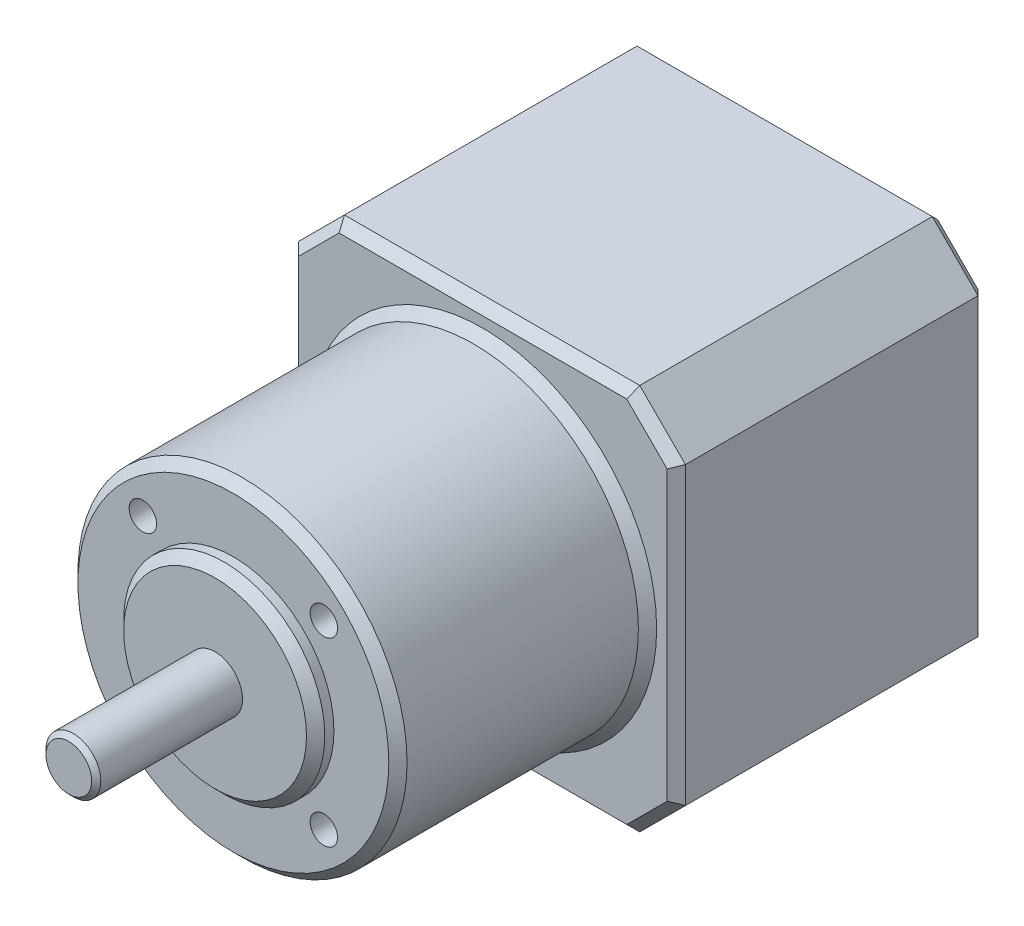
ISO-10303-21;
HEADER;
FILE_DESCRIPTION(('STEP AP214'),'2;1');
FILE_NAME('part.step','',(''),(''),'','','');
FILE_SCHEMA(('AUTOMOTIVE_DESIGN { 1 0 10303 214 1 1 1 1 }'));
ENDSEC;
DATA;
#1=APPLICATION_CONTEXT('core data for automotive mechanical design processes');
#2=APPLICATION_PROTOCOL_DEFINITION('international standard','automotive_design',2000,#1);
#3=PRODUCT_CONTEXT('',#1,'mechanical');
#4=PRODUCT('Part','Part','',(#3));
#5=PRODUCT_RELATED_PRODUCT_CATEGORY('part','',(#4));
#6=PRODUCT_DEFINITION_FORMATION('','',#4);
#7=PRODUCT_DEFINITION_CONTEXT('part definition',#1,'design');
#8=PRODUCT_DEFINITION('design','',#6,#7);
#9=PRODUCT_DEFINITION_SHAPE('','',#8);
#10=(LENGTH_UNIT() NAMED_UNIT(*) SI_UNIT(.MILLI.,.METRE.));
#11=(NAMED_UNIT(*) PLANE_ANGLE_UNIT() SI_UNIT($,.RADIAN.));
#12=(NAMED_UNIT(*) SI_UNIT($,.STERADIAN.) SOLID_ANGLE_UNIT());
#13=UNCERTAINTY_MEASURE_WITH_UNIT(LENGTH_MEASURE(1.E-05),#10,'distance_accuracy_value','');
#14=(GEOMETRIC_REPRESENTATION_CONTEXT(3) GLOBAL_UNCERTAINTY_ASSIGNED_CONTEXT((#13)) GLOBAL_UNIT_ASSIGNED_CONTEXT((#10,
#11,#12)) REPRESENTATION_CONTEXT('',''));
#15=CARTESIAN_POINT('',(0.,0.,0.));
#16=DIRECTION('',(0.,0.,1.));
#17=DIRECTION('',(1.,0.,0.));
#18=AXIS2_PLACEMENT_3D('',#15,#16,#17);
#19=CARTESIAN_POINT('',(10.575,10.575,30.6344737091177));
#20=DIRECTION('',(-1.,0.,0.));
#21=DIRECTION('',(0.,0.,1.));
#22=AXIS2_PLACEMENT_3D('',#19,#20,#21);
#23=PLANE('',#22);
#24=DIRECTION('',(0.,0.,1.));
#25=VECTOR('',#24,1.);
#26=CARTESIAN_POINT('',(10.575,8.075,30.6344737091177));
#27=LINE('',#26,#25);
#28=CARTESIAN_POINT('',(10.575,8.075,14.1344737091177));
#29=VERTEX_POINT('',#28);
#30=CARTESIAN_POINT('',(10.575,8.075,30.1344737091177));
#31=VERTEX_POINT('',#30);
#32=EDGE_CURVE('E445',#29,#31,#27,.T.);
#33=ORIENTED_EDGE('',*,*,#32,.T.);
#34=DIRECTION('',(0.,-1.,0.));
#35=VECTOR('',#34,1.);
#36=CARTESIAN_POINT('',(10.575,-8.075,30.1344737091177));
#37=LINE('',#36,#35);
#38=CARTESIAN_POINT('',(10.575,-8.075,30.1344737091177));
#39=VERTEX_POINT('',#38);
#40=EDGE_CURVE('E198',#31,#39,#37,.T.);
#41=ORIENTED_EDGE('',*,*,#40,.T.);
#42=DIRECTION('',(0.,0.,-1.));
#43=VECTOR('',#42,1.);
#44=CARTESIAN_POINT('',(10.575,-8.075,30.6344737091177));
#45=LINE('',#44,#43);
#46=CARTESIAN_POINT('',(10.575,-8.075,14.1344737091177));
#47=VERTEX_POINT('',#46);
#48=EDGE_CURVE('E422',#39,#47,#45,.T.);
#49=ORIENTED_EDGE('',*,*,#48,.T.);
#50=DIRECTION('',(0.,1.,0.));
#51=VECTOR('',#50,1.);
#52=CARTESIAN_POINT('',(10.575,10.575,14.1344737091177));
#53=LINE('',#52,#51);
#54=EDGE_CURVE('E196',#47,#29,#53,.T.);
#55=ORIENTED_EDGE('',*,*,#54,.T.);
#56=EDGE_LOOP('',(#33,#41,#49,#55));
#57=FACE_BOUND('',#56,.T.);
#58=ADVANCED_FACE('F39',(#57),#23,.F.);
#59=CARTESIAN_POINT('',(-10.575,10.575,30.6344737091177));
#60=DIRECTION('',(0.,-1.,0.));
#61=DIRECTION('',(0.,0.,-1.));
#62=AXIS2_PLACEMENT_3D('',#59,#60,#61);
#63=PLANE('',#62);
#64=DIRECTION('',(0.,0.,1.));
#65=VECTOR('',#64,1.);
#66=CARTESIAN_POINT('',(-8.07499999999999,10.575,30.6344737091177));
#67=LINE('',#66,#65);
#68=CARTESIAN_POINT('',(-8.07499999999999,10.575,14.1344737091177));
#69=VERTEX_POINT('',#68);
#70=CARTESIAN_POINT('',(-8.07499999999999,10.575,30.1344737091177));
#71=VERTEX_POINT('',#70);
#72=EDGE_CURVE('E442',#69,#71,#67,.T.);
#73=ORIENTED_EDGE('',*,*,#72,.T.);
#74=DIRECTION('',(1.,0.,0.));
#75=VECTOR('',#74,1.);
#76=CARTESIAN_POINT('',(8.075,10.575,30.1344737091177));
#77=LINE('',#76,#75);
#78=CARTESIAN_POINT('',(8.075,10.575,30.1344737091177));
#79=VERTEX_POINT('',#78);
#80=EDGE_CURVE('E190',#71,#79,#77,.T.);
#81=ORIENTED_EDGE('',*,*,#80,.T.);
#82=DIRECTION('',(0.,0.,-1.));
#83=VECTOR('',#82,1.);
#84=CARTESIAN_POINT('',(8.075,10.575,30.6344737091177));
#85=LINE('',#84,#83);
#86=CARTESIAN_POINT('',(8.075,10.575,14.1344737091177));
#87=VERTEX_POINT('',#86);
#88=EDGE_CURVE('E439',#79,#87,#85,.T.);
#89=ORIENTED_EDGE('',*,*,#88,.T.);
#90=DIRECTION('',(-1.,0.,0.));
#91=VECTOR('',#90,1.);
#92=CARTESIAN_POINT('',(-10.575,10.575,14.1344737091177));
#93=LINE('',#92,#91);
#94=EDGE_CURVE('E188',#87,#69,#93,.T.);
#95=ORIENTED_EDGE('',*,*,#94,.T.);
#96=EDGE_LOOP('',(#73,#81,#89,#95));
#97=FACE_BOUND('',#96,.T.);
#98=ADVANCED_FACE('F305',(#97),#63,.F.);
#99=CARTESIAN_POINT('',(-10.575,10.575,30.6344737091177));
#100=DIRECTION('',(1.,0.,0.));
#101=DIRECTION('',(0.,1.,0.));
#102=AXIS2_PLACEMENT_3D('',#99,#100,#101);
#103=PLANE('',#102);
#104=DIRECTION('',(0.,0.,1.));
#105=VECTOR('',#104,1.);
#106=CARTESIAN_POINT('',(-10.575,-8.07499999999998,30.6344737091177));
#107=LINE('',#106,#105);
#108=CARTESIAN_POINT('',(-10.575,-8.07499999999998,14.1344737091177));
#109=VERTEX_POINT('',#108);
#110=CARTESIAN_POINT('',(-10.575,-8.07499999999998,30.1344737091177));
#111=VERTEX_POINT('',#110);
#112=EDGE_CURVE('E436',#109,#111,#107,.T.);
#113=ORIENTED_EDGE('',*,*,#112,.T.);
#114=DIRECTION('',(0.,1.,0.));
#115=VECTOR('',#114,1.);
#116=CARTESIAN_POINT('',(-10.575,8.075,30.1344737091177));
#117=LINE('',#116,#115);
#118=CARTESIAN_POINT('',(-10.575,8.075,30.1344737091177));
#119=VERTEX_POINT('',#118);
#120=EDGE_CURVE('E215',#111,#119,#117,.T.);
#121=ORIENTED_EDGE('',*,*,#120,.T.);
#122=DIRECTION('',(0.,0.,-1.));
#123=VECTOR('',#122,1.);
#124=CARTESIAN_POINT('',(-10.575,8.075,30.6344737091177));
#125=LINE('',#124,#123);
#126=CARTESIAN_POINT('',(-10.575,8.075,14.1344737091177));
#127=VERTEX_POINT('',#126);
#128=EDGE_CURVE('E433',#119,#127,#125,.T.);
#129=ORIENTED_EDGE('',*,*,#128,.T.);
#130=DIRECTION('',(0.,-1.,0.));
#131=VECTOR('',#130,1.);
#132=CARTESIAN_POINT('',(-10.575,10.575,14.1344737091177));
#133=LINE('',#132,#131);
#134=EDGE_CURVE('E213',#127,#109,#133,.T.);
#135=ORIENTED_EDGE('',*,*,#134,.T.);
#136=EDGE_LOOP('',(#113,#121,#129,#135));
#137=FACE_BOUND('',#136,.T.);
#138=ADVANCED_FACE('F311',(#137),#103,.F.);
#139=CARTESIAN_POINT('',(-10.575,-10.575,30.6344737091177));
#140=DIRECTION('',(0.,1.,0.));
#141=DIRECTION('',(0.,0.,1.));
#142=AXIS2_PLACEMENT_3D('',#139,#140,#141);
#143=PLANE('',#142);
#144=DIRECTION('',(0.,0.,1.));
#145=VECTOR('',#144,1.);
#146=CARTESIAN_POINT('',(8.075,-10.575,30.6344737091177));
#147=LINE('',#146,#145);
#148=CARTESIAN_POINT('',(8.075,-10.575,14.1344737091177));
#149=VERTEX_POINT('',#148);
#150=CARTESIAN_POINT('',(8.075,-10.575,30.1344737091177));
#151=VERTEX_POINT('',#150);
#152=EDGE_CURVE('E263',#149,#151,#147,.T.);
#153=ORIENTED_EDGE('',*,*,#152,.T.);
#154=DIRECTION('',(-1.,0.,0.));
#155=VECTOR('',#154,1.);
#156=CARTESIAN_POINT('',(-8.07499999999999,-10.575,30.1344737091177));
#157=LINE('',#156,#155);
#158=CARTESIAN_POINT('',(-8.07499999999999,-10.575,30.1344737091177));
#159=VERTEX_POINT('',#158);
#160=EDGE_CURVE('E207',#151,#159,#157,.T.);
#161=ORIENTED_EDGE('',*,*,#160,.T.);
#162=DIRECTION('',(0.,0.,-1.));
#163=VECTOR('',#162,1.);
#164=CARTESIAN_POINT('',(-8.07499999999999,-10.575,30.6344737091177));
#165=LINE('',#164,#163);
#166=CARTESIAN_POINT('',(-8.07499999999999,-10.575,14.1344737091177));
#167=VERTEX_POINT('',#166);
#168=EDGE_CURVE('E430',#159,#167,#165,.T.);
#169=ORIENTED_EDGE('',*,*,#168,.T.);
#170=DIRECTION('',(1.,0.,0.));
#171=VECTOR('',#170,1.);
#172=CARTESIAN_POINT('',(-10.575,-10.575,14.1344737091177));
#173=LINE('',#172,#171);
#174=EDGE_CURVE('E205',#167,#149,#173,.T.);
#175=ORIENTED_EDGE('',*,*,#174,.T.);
#176=EDGE_LOOP('',(#153,#161,#169,#175));
#177=FACE_BOUND('',#176,.T.);
#178=ADVANCED_FACE('F483',(#177),#143,.F.);
#179=CARTESIAN_POINT('',(0.,0.,30.6344737091177));
#180=DIRECTION('',(0.,0.,1.));
#181=DIRECTION('',(1.,0.,0.));
#182=AXIS2_PLACEMENT_3D('',#179,#180,#181);
#183=PLANE('',#182);
#184=DIRECTION('',(-1.,0.,0.));
#185=VECTOR('',#184,1.);
#186=CARTESIAN_POINT('',(-8.07499999999999,10.075,30.6344737091177));
#187=LINE('',#186,#185);
#188=CARTESIAN_POINT('',(7.86789321881345,10.075,30.6344737091177));
#189=VERTEX_POINT('',#188);
#190=CARTESIAN_POINT('',(-7.86789321881344,10.075,30.6344737091177));
#191=VERTEX_POINT('',#190);
#192=EDGE_CURVE('E178',#189,#191,#187,.T.);
#193=ORIENTED_EDGE('',*,*,#192,.T.);
#194=DIRECTION('',(-0.707106781186549,-0.707106781186547,0.));
#195=VECTOR('',#194,1.);
#196=CARTESIAN_POINT('',(-8.97144660940671,8.97144660940674,30.6344737091177));
#197=LINE('',#196,#195);
#198=CARTESIAN_POINT('',(-10.075,7.86789321881346,30.6344737091177));
#199=VERTEX_POINT('',#198);
#200=EDGE_CURVE('E157',#191,#199,#197,.T.);
#201=ORIENTED_EDGE('',*,*,#200,.T.);
#202=DIRECTION('',(0.,-1.,0.));
#203=VECTOR('',#202,1.);
#204=CARTESIAN_POINT('',(-10.075,-8.07499999999998,30.6344737091177));
#205=LINE('',#204,#203);
#206=CARTESIAN_POINT('',(-10.075,-7.86789321881343,30.6344737091177));
#207=VERTEX_POINT('',#206);
#208=EDGE_CURVE('E166',#199,#207,#205,.T.);
#209=ORIENTED_EDGE('',*,*,#208,.T.);
#210=DIRECTION('',(0.707106781186546,-0.707106781186549,0.));
#211=VECTOR('',#210,1.);
#212=CARTESIAN_POINT('',(-8.97144660940673,-8.97144660940669,30.6344737091177));
#213=LINE('',#212,#211);
#214=CARTESIAN_POINT('',(-7.86789321881344,-10.075,30.6344737091177));
#215=VERTEX_POINT('',#214);
#216=EDGE_CURVE('E172',#207,#215,#213,.T.);
#217=ORIENTED_EDGE('',*,*,#216,.T.);
#218=DIRECTION('',(1.,0.,0.));
#219=VECTOR('',#218,1.);
#220=CARTESIAN_POINT('',(8.07499999999999,-10.075,30.6344737091177));
#221=LINE('',#220,#219);
#222=CARTESIAN_POINT('',(7.86789321881345,-10.075,30.6344737091177));
#223=VERTEX_POINT('',#222);
#224=EDGE_CURVE('E450',#215,#223,#221,.T.);
#225=ORIENTED_EDGE('',*,*,#224,.T.);
#226=DIRECTION('',(0.707106781186548,0.707106781186547,0.));
#227=VECTOR('',#226,1.);
#228=CARTESIAN_POINT('',(8.97144660940671,-8.97144660940672,30.6344737091177));
#229=LINE('',#228,#227);
#230=CARTESIAN_POINT('',(10.075,-7.86789321881344,30.6344737091177));
#231=VERTEX_POINT('',#230);
#232=EDGE_CURVE('E452',#223,#231,#229,.T.);
#233=ORIENTED_EDGE('',*,*,#232,.T.);
#234=DIRECTION('',(0.,1.,0.));
#235=VECTOR('',#234,1.);
#236=CARTESIAN_POINT('',(10.075,8.075,30.6344737091177));
#237=LINE('',#236,#235);
#238=CARTESIAN_POINT('',(10.075,7.86789321881345,30.6344737091177));
#239=VERTEX_POINT('',#238);
#240=EDGE_CURVE('E454',#231,#239,#237,.T.);
#241=ORIENTED_EDGE('',*,*,#240,.T.);
#242=DIRECTION('',(-0.707106781186547,0.707106781186549,0.));
#243=VECTOR('',#242,1.);
#244=CARTESIAN_POINT('',(8.97144660940674,8.97144660940671,30.6344737091177));
#245=LINE('',#244,#243);
#246=EDGE_CURVE('E183',#239,#189,#245,.T.);
#247=ORIENTED_EDGE('',*,*,#246,.T.);
#248=EDGE_LOOP('',(#193,#201,#209,#217,#225,#233,#241,#247));
#249=FACE_BOUND('',#248,.T.);
#250=CARTESIAN_POINT('',(0.,0.,30.6344737091177));
#251=DIRECTION('',(0.,0.,1.));
#252=DIRECTION('',(1.,0.,0.));
#253=AXIS2_PLACEMENT_3D('',#250,#251,#252);
#254=CIRCLE('',#253,9.49999999999999);
#255=CARTESIAN_POINT('',(9.49999999999999,0.,30.6344737091177));
#256=VERTEX_POINT('',#255);
#257=EDGE_CURVE('E173',#256,#256,#254,.F.);
#258=ORIENTED_EDGE('',*,*,#257,.T.);
#259=EDGE_LOOP('',(#258));
#260=FACE_BOUND('',#259,.T.);
#261=ADVANCED_FACE('F175',(#249,#260),#183,.T.);
#262=CARTESIAN_POINT('',(0.,0.,13.6344737091177));
#263=DIRECTION('',(0.,0.,1.));
#264=DIRECTION('',(1.,0.,0.));
#265=AXIS2_PLACEMENT_3D('',#262,#263,#264);
#266=PLANE('',#265);
#267=DIRECTION('',(0.,-1.,0.));
#268=VECTOR('',#267,1.);
#269=CARTESIAN_POINT('',(10.075,0.,13.6344737091177));
#270=LINE('',#269,#268);
#271=CARTESIAN_POINT('',(10.075,7.86789321881345,13.6344737091177));
#272=VERTEX_POINT('',#271);
#273=CARTESIAN_POINT('',(10.075,-7.86789321881344,13.6344737091177));
#274=VERTEX_POINT('',#273);
#275=EDGE_CURVE('E54',#272,#274,#270,.T.);
#276=ORIENTED_EDGE('',*,*,#275,.T.);
#277=DIRECTION('',(-0.707106781186548,-0.707106781186547,0.));
#278=VECTOR('',#277,1.);
#279=CARTESIAN_POINT('',(7.72144660940671,-10.2214466094067,13.6344737091177));
#280=LINE('',#279,#278);
#281=CARTESIAN_POINT('',(7.86789321881345,-10.075,13.6344737091177));
#282=VERTEX_POINT('',#281);
#283=EDGE_CURVE('E235',#274,#282,#280,.T.);
#284=ORIENTED_EDGE('',*,*,#283,.T.);
#285=DIRECTION('',(-1.,0.,0.));
#286=VECTOR('',#285,1.);
#287=CARTESIAN_POINT('',(0.,-10.075,13.6344737091177));
#288=LINE('',#287,#286);
#289=CARTESIAN_POINT('',(-7.86789321881344,-10.075,13.6344737091177));
#290=VERTEX_POINT('',#289);
#291=EDGE_CURVE('E223',#282,#290,#288,.T.);
#292=ORIENTED_EDGE('',*,*,#291,.T.);
#293=DIRECTION('',(-0.707106781186546,0.707106781186549,0.));
#294=VECTOR('',#293,1.);
#295=CARTESIAN_POINT('',(-10.2214466094067,-7.72144660940671,13.6344737091177));
#296=LINE('',#295,#294);
#297=CARTESIAN_POINT('',(-10.075,-7.86789321881343,13.6344737091177));
#298=VERTEX_POINT('',#297);
#299=EDGE_CURVE('E225',#290,#298,#296,.T.);
#300=ORIENTED_EDGE('',*,*,#299,.T.);
#301=DIRECTION('',(0.,1.,0.));
#302=VECTOR('',#301,1.);
#303=CARTESIAN_POINT('',(-10.075,0.,13.6344737091177));
#304=LINE('',#303,#302);
#305=CARTESIAN_POINT('',(-10.075,7.86789321881346,13.6344737091177));
#306=VERTEX_POINT('',#305);
#307=EDGE_CURVE('E227',#298,#306,#304,.T.);
#308=ORIENTED_EDGE('',*,*,#307,.T.);
#309=DIRECTION('',(0.707106781186549,0.707106781186547,0.));
#310=VECTOR('',#309,1.);
#311=CARTESIAN_POINT('',(-7.72144660940671,10.2214466094067,13.6344737091177));
#312=LINE('',#311,#310);
#313=CARTESIAN_POINT('',(-7.86789321881344,10.075,13.6344737091177));
#314=VERTEX_POINT('',#313);
#315=EDGE_CURVE('E229',#306,#314,#312,.T.);
#316=ORIENTED_EDGE('',*,*,#315,.T.);
#317=DIRECTION('',(1.,0.,0.));
#318=VECTOR('',#317,1.);
#319=CARTESIAN_POINT('',(0.,10.075,13.6344737091177));
#320=LINE('',#319,#318);
#321=CARTESIAN_POINT('',(7.86789321881345,10.075,13.6344737091177));
#322=VERTEX_POINT('',#321);
#323=EDGE_CURVE('E231',#314,#322,#320,.T.);
#324=ORIENTED_EDGE('',*,*,#323,.T.);
#325=DIRECTION('',(0.707106781186547,-0.707106781186549,0.));
#326=VECTOR('',#325,1.);
#327=CARTESIAN_POINT('',(10.2214466094067,7.72144660940672,13.6344737091177));
#328=LINE('',#327,#326);
#329=EDGE_CURVE('E59',#322,#272,#328,.T.);
#330=ORIENTED_EDGE('',*,*,#329,.T.);
#331=EDGE_LOOP('',(#276,#284,#292,#300,#308,#316,#324,#330));
#332=FACE_BOUND('',#331,.T.);
#333=ADVANCED_FACE('F321',(#332),#266,.F.);
#334=CARTESIAN_POINT('',(-8.07499999999999,-10.575,30.6344737091177));
#335=DIRECTION('',(0.707106781186549,0.707106781186546,0.));
#336=DIRECTION('',(0.,0.,-1.));
#337=AXIS2_PLACEMENT_3D('',#334,#335,#336);
#338=PLANE('',#337);
#339=ORIENTED_EDGE('',*,*,#168,.F.);
#340=DIRECTION('',(0.707106781186546,-0.707106781186549,0.));
#341=VECTOR('',#340,1.);
#342=CARTESIAN_POINT('',(-8.07499999999999,-10.575,30.1344737091177));
#343=LINE('',#342,#341);
#344=EDGE_CURVE('E211',#159,#111,#343,.F.);
#345=ORIENTED_EDGE('',*,*,#344,.T.);
#346=ORIENTED_EDGE('',*,*,#112,.F.);
#347=DIRECTION('',(-0.707106781186546,0.707106781186549,0.));
#348=VECTOR('',#347,1.);
#349=CARTESIAN_POINT('',(-8.07499999999999,-10.575,14.1344737091177));
#350=LINE('',#349,#348);
#351=EDGE_CURVE('E209',#109,#167,#350,.F.);
#352=ORIENTED_EDGE('',*,*,#351,.T.);
#353=EDGE_LOOP('',(#339,#345,#346,#352));
#354=FACE_BOUND('',#353,.T.);
#355=ADVANCED_FACE('F317',(#354),#338,.F.);
#356=CARTESIAN_POINT('',(-10.575,8.075,30.6344737091177));
#357=DIRECTION('',(0.707106781186547,-0.707106781186549,0.));
#358=DIRECTION('',(0.,0.,-1.));
#359=AXIS2_PLACEMENT_3D('',#356,#357,#358);
#360=PLANE('',#359);
#361=ORIENTED_EDGE('',*,*,#128,.F.);
#362=DIRECTION('',(-0.707106781186549,-0.707106781186547,0.));
#363=VECTOR('',#362,1.);
#364=CARTESIAN_POINT('',(-10.575,8.075,30.1344737091177));
#365=LINE('',#364,#363);
#366=EDGE_CURVE('E159',#119,#71,#365,.F.);
#367=ORIENTED_EDGE('',*,*,#366,.T.);
#368=ORIENTED_EDGE('',*,*,#72,.F.);
#369=DIRECTION('',(0.707106781186549,0.707106781186547,0.));
#370=VECTOR('',#369,1.);
#371=CARTESIAN_POINT('',(-10.575,8.075,14.1344737091177));
#372=LINE('',#371,#370);
#373=EDGE_CURVE('E180',#69,#127,#372,.F.);
#374=ORIENTED_EDGE('',*,*,#373,.T.);
#375=EDGE_LOOP('',(#361,#367,#368,#374));
#376=FACE_BOUND('',#375,.T.);
#377=ADVANCED_FACE('F320',(#376),#360,.F.);
#378=CARTESIAN_POINT('',(10.575,-8.075,30.6344737091177));
#379=DIRECTION('',(-0.707106781186547,0.707106781186548,0.));
#380=DIRECTION('',(0.,0.,-1.));
#381=AXIS2_PLACEMENT_3D('',#378,#379,#380);
#382=PLANE('',#381);
#383=ORIENTED_EDGE('',*,*,#48,.F.);
#384=DIRECTION('',(0.707106781186548,0.707106781186547,0.));
#385=VECTOR('',#384,1.);
#386=CARTESIAN_POINT('',(10.575,-8.075,30.1344737091177));
#387=LINE('',#386,#385);
#388=EDGE_CURVE('E203',#39,#151,#387,.F.);
#389=ORIENTED_EDGE('',*,*,#388,.T.);
#390=ORIENTED_EDGE('',*,*,#152,.F.);
#391=DIRECTION('',(-0.707106781186548,-0.707106781186547,0.));
#392=VECTOR('',#391,1.);
#393=CARTESIAN_POINT('',(10.575,-8.07499999999999,14.1344737091177));
#394=LINE('',#393,#392);
#395=EDGE_CURVE('E200',#149,#47,#394,.F.);
#396=ORIENTED_EDGE('',*,*,#395,.T.);
#397=EDGE_LOOP('',(#383,#389,#390,#396));
#398=FACE_BOUND('',#397,.T.);
#399=ADVANCED_FACE('F325',(#398),#382,.F.);
#400=CARTESIAN_POINT('',(8.075,10.575,30.6344737091177));
#401=DIRECTION('',(-0.707106781186549,-0.707106781186547,0.));
#402=DIRECTION('',(0.,0.,-1.));
#403=AXIS2_PLACEMENT_3D('',#400,#401,#402);
#404=PLANE('',#403);
#405=ORIENTED_EDGE('',*,*,#88,.F.);
#406=DIRECTION('',(-0.707106781186547,0.707106781186549,0.));
#407=VECTOR('',#406,1.);
#408=CARTESIAN_POINT('',(8.075,10.575,30.1344737091177));
#409=LINE('',#408,#407);
#410=EDGE_CURVE('E194',#79,#31,#409,.F.);
#411=ORIENTED_EDGE('',*,*,#410,.T.);
#412=ORIENTED_EDGE('',*,*,#32,.F.);
#413=DIRECTION('',(0.707106781186547,-0.707106781186549,0.));
#414=VECTOR('',#413,1.);
#415=CARTESIAN_POINT('',(8.075,10.575,14.1344737091177));
#416=LINE('',#415,#414);
#417=EDGE_CURVE('E192',#29,#87,#416,.F.);
#418=ORIENTED_EDGE('',*,*,#417,.T.);
#419=EDGE_LOOP('',(#405,#411,#412,#418));
#420=FACE_BOUND('',#419,.T.);
#421=ADVANCED_FACE('F329',(#420),#404,.F.);
#422=CARTESIAN_POINT('',(0.,0.,44.2844737091177));
#423=DIRECTION('',(0.,0.,-1.));
#424=DIRECTION('',(-1.,0.,0.));
#425=AXIS2_PLACEMENT_3D('',#422,#423,#424);
#426=CYLINDRICAL_SURFACE('',#425,9.);
#427=CARTESIAN_POINT('',(0.,0.,31.1344737091177));
#428=DIRECTION('',(0.,0.,1.));
#429=DIRECTION('',(1.,0.,0.));
#430=AXIS2_PLACEMENT_3D('',#427,#428,#429);
#431=CIRCLE('',#430,9.);
#432=CARTESIAN_POINT('',(9.,0.,31.1344737091177));
#433=VERTEX_POINT('',#432);
#434=EDGE_CURVE('E220',#433,#433,#431,.T.);
#435=ORIENTED_EDGE('',*,*,#434,.T.);
#436=EDGE_LOOP('',(#435));
#437=FACE_BOUND('',#436,.T.);
#438=CARTESIAN_POINT('',(0.,0.,43.7844737091177));
#439=DIRECTION('',(0.,0.,1.));
#440=DIRECTION('',(1.,0.,0.));
#441=AXIS2_PLACEMENT_3D('',#438,#439,#440);
#442=CIRCLE('',#441,9.);
#443=CARTESIAN_POINT('',(9.,0.,43.7844737091177));
#444=VERTEX_POINT('',#443);
#445=EDGE_CURVE('E217',#444,#444,#442,.F.);
#446=ORIENTED_EDGE('',*,*,#445,.T.);
#447=EDGE_LOOP('',(#446));
#448=FACE_BOUND('',#447,.T.);
#449=ADVANCED_FACE('F333',(#437,#448),#426,.T.);
#450=CARTESIAN_POINT('',(0.,0.,44.2844737091177));
#451=DIRECTION('',(0.,0.,1.));
#452=DIRECTION('',(1.,0.,0.));
#453=AXIS2_PLACEMENT_3D('',#450,#451,#452);
#454=PLANE('',#453);
#455=CARTESIAN_POINT('',(-4.94974746830579,4.94974746830588,44.2844737091177));
#456=DIRECTION('',(0.,0.,1.));
#457=DIRECTION('',(1.,0.,0.));
#458=AXIS2_PLACEMENT_3D('',#455,#456,#457);
#459=CIRCLE('',#458,0.749999999999999);
#460=CARTESIAN_POINT('',(-4.19974746830579,4.94974746830588,44.2844737091177));
#461=VERTEX_POINT('',#460);
#462=EDGE_CURVE('E572',#461,#461,#459,.T.);
#463=ORIENTED_EDGE('',*,*,#462,.F.);
#464=EDGE_LOOP('',(#463));
#465=FACE_BOUND('',#464,.T.);
#466=CARTESIAN_POINT('',(-4.94974746830586,-4.94974746830581,44.2844737091177));
#467=DIRECTION('',(0.,0.,1.));
#468=DIRECTION('',(1.,0.,0.));
#469=AXIS2_PLACEMENT_3D('',#466,#467,#468);
#470=CIRCLE('',#469,0.749999999999999);
#471=CARTESIAN_POINT('',(-4.19974746830586,-4.94974746830581,44.2844737091177));
#472=VERTEX_POINT('',#471);
#473=EDGE_CURVE('E566',#472,#472,#470,.T.);
#474=ORIENTED_EDGE('',*,*,#473,.F.);
#475=EDGE_LOOP('',(#474));
#476=FACE_BOUND('',#475,.T.);
#477=CARTESIAN_POINT('',(4.94974746830583,-4.94974746830584,44.2844737091177));
#478=DIRECTION('',(0.,0.,1.));
#479=DIRECTION('',(1.,0.,0.));
#480=AXIS2_PLACEMENT_3D('',#477,#478,#479);
#481=CIRCLE('',#480,0.749999999999999);
#482=CARTESIAN_POINT('',(5.69974746830583,-4.94974746830584,44.2844737091177));
#483=VERTEX_POINT('',#482);
#484=EDGE_CURVE('E557',#483,#483,#481,.T.);
#485=ORIENTED_EDGE('',*,*,#484,.F.);
#486=EDGE_LOOP('',(#485));
#487=FACE_BOUND('',#486,.T.);
#488=CARTESIAN_POINT('',(4.94974746830582,4.94974746830584,44.2844737091177));
#489=DIRECTION('',(0.,0.,1.));
#490=DIRECTION('',(1.,0.,0.));
#491=AXIS2_PLACEMENT_3D('',#488,#489,#490);
#492=CIRCLE('',#491,0.749999999999999);
#493=CARTESIAN_POINT('',(5.69974746830582,4.94974746830584,44.2844737091177));
#494=VERTEX_POINT('',#493);
#495=EDGE_CURVE('E425',#494,#494,#492,.T.);
#496=ORIENTED_EDGE('',*,*,#495,.F.);
#497=EDGE_LOOP('',(#496));
#498=FACE_BOUND('',#497,.T.);
#499=CARTESIAN_POINT('',(0.,0.,44.2844737091177));
#500=DIRECTION('',(0.,0.,1.));
#501=DIRECTION('',(1.,0.,0.));
#502=AXIS2_PLACEMENT_3D('',#499,#500,#501);
#503=CIRCLE('',#502,8.5);
#504=CARTESIAN_POINT('',(8.5,0.,44.2844737091177));
#505=VERTEX_POINT('',#504);
#506=EDGE_CURVE('E243',#505,#505,#503,.T.);
#507=ORIENTED_EDGE('',*,*,#506,.T.);
#508=EDGE_LOOP('',(#507));
#509=FACE_BOUND('',#508,.T.);
#510=CARTESIAN_POINT('',(0.,0.,44.2844737091177));
#511=DIRECTION('',(0.,0.,1.));
#512=DIRECTION('',(1.,0.,0.));
#513=AXIS2_PLACEMENT_3D('',#510,#511,#512);
#514=CIRCLE('',#513,5.5);
#515=CARTESIAN_POINT('',(5.5,0.,44.2844737091177));
#516=VERTEX_POINT('',#515);
#517=EDGE_CURVE('E417',#516,#516,#514,.T.);
#518=ORIENTED_EDGE('',*,*,#517,.F.);
#519=EDGE_LOOP('',(#518));
#520=FACE_BOUND('',#519,.T.);
#521=ADVANCED_FACE('F513',(#465,#476,#487,#498,#509,#520),#454,.T.);
#522=CARTESIAN_POINT('',(0.,0.,45.2844737091177));
#523=DIRECTION('',(0.,0.,-1.));
#524=DIRECTION('',(-1.,0.,0.));
#525=AXIS2_PLACEMENT_3D('',#522,#523,#524);
#526=CYLINDRICAL_SURFACE('',#525,5.5);
#527=CARTESIAN_POINT('',(0.,0.,44.7844737091177));
#528=DIRECTION('',(0.,0.,1.));
#529=DIRECTION('',(1.,0.,0.));
#530=AXIS2_PLACEMENT_3D('',#527,#528,#529);
#531=CIRCLE('',#530,5.5);
#532=CARTESIAN_POINT('',(5.5,0.,44.7844737091177));
#533=VERTEX_POINT('',#532);
#534=EDGE_CURVE('E240',#533,#533,#531,.F.);
#535=ORIENTED_EDGE('',*,*,#534,.T.);
#536=EDGE_LOOP('',(#535));
#537=FACE_BOUND('',#536,.T.);
#538=ORIENTED_EDGE('',*,*,#517,.T.);
#539=EDGE_LOOP('',(#538));
#540=FACE_BOUND('',#539,.T.);
#541=ADVANCED_FACE('F411',(#537,#540),#526,.T.);
#542=CARTESIAN_POINT('',(0.,0.,45.2844737091177));
#543=DIRECTION('',(0.,0.,1.));
#544=DIRECTION('',(1.,0.,0.));
#545=AXIS2_PLACEMENT_3D('',#542,#543,#544);
#546=PLANE('',#545);
#547=CARTESIAN_POINT('',(0.,0.,45.2844737091177));
#548=DIRECTION('',(0.,0.,1.));
#549=DIRECTION('',(1.,0.,0.));
#550=AXIS2_PLACEMENT_3D('',#547,#548,#549);
#551=CIRCLE('',#550,5.);
#552=CARTESIAN_POINT('',(5.,0.,45.2844737091177));
#553=VERTEX_POINT('',#552);
#554=EDGE_CURVE('E237',#553,#553,#551,.T.);
#555=ORIENTED_EDGE('',*,*,#554,.T.);
#556=EDGE_LOOP('',(#555));
#557=FACE_BOUND('',#556,.T.);
#558=CARTESIAN_POINT('',(0.,0.,45.2844737091177));
#559=DIRECTION('',(0.,0.,1.));
#560=DIRECTION('',(1.,0.,0.));
#561=AXIS2_PLACEMENT_3D('',#558,#559,#560);
#562=CIRCLE('',#561,1.5);
#563=CARTESIAN_POINT('',(1.5,0.,45.2844737091177));
#564=VERTEX_POINT('',#563);
#565=EDGE_CURVE('E415',#564,#564,#562,.T.);
#566=ORIENTED_EDGE('',*,*,#565,.F.);
#567=EDGE_LOOP('',(#566));
#568=FACE_BOUND('',#567,.T.);
#569=ADVANCED_FACE('F407',(#557,#568),#546,.T.);
#570=CARTESIAN_POINT('',(0.,0.,53.2844737091177));
#571=DIRECTION('',(0.,0.,-1.));
#572=DIRECTION('',(-1.,0.,0.));
#573=AXIS2_PLACEMENT_3D('',#570,#571,#572);
#574=CYLINDRICAL_SURFACE('',#573,1.5);
#575=CARTESIAN_POINT('',(0.,0.,53.0344737091177));
#576=DIRECTION('',(0.,0.,1.));
#577=DIRECTION('',(1.,0.,0.));
#578=AXIS2_PLACEMENT_3D('',#575,#576,#577);
#579=CIRCLE('',#578,1.5);
#580=CARTESIAN_POINT('',(1.5,0.,53.0344737091177));
#581=VERTEX_POINT('',#580);
#582=EDGE_CURVE('E11',#581,#581,#579,.F.);
#583=ORIENTED_EDGE('',*,*,#582,.T.);
#584=EDGE_LOOP('',(#583));
#585=FACE_BOUND('',#584,.T.);
#586=ORIENTED_EDGE('',*,*,#565,.T.);
#587=EDGE_LOOP('',(#586));
#588=FACE_BOUND('',#587,.T.);
#589=ADVANCED_FACE('F410',(#585,#588),#574,.T.);
#590=CARTESIAN_POINT('',(0.,0.,53.2844737091177));
#591=DIRECTION('',(0.,0.,1.));
#592=DIRECTION('',(1.,0.,0.));
#593=AXIS2_PLACEMENT_3D('',#590,#591,#592);
#594=PLANE('',#593);
#595=CARTESIAN_POINT('',(0.,0.,53.2844737091177));
#596=DIRECTION('',(0.,0.,1.));
#597=DIRECTION('',(1.,0.,0.));
#598=AXIS2_PLACEMENT_3D('',#595,#596,#597);
#599=CIRCLE('',#598,1.25);
#600=CARTESIAN_POINT('',(1.25,0.,53.2844737091177));
#601=VERTEX_POINT('',#600);
#602=EDGE_CURVE('E47',#601,#601,#599,.T.);
#603=ORIENTED_EDGE('',*,*,#602,.T.);
#604=EDGE_LOOP('',(#603));
#605=FACE_BOUND('',#604,.T.);
#606=ADVANCED_FACE('F288',(#605),#594,.T.);
#607=CARTESIAN_POINT('',(8.97144660940671,-8.97144660940672,30.6344737091177));
#608=DIRECTION('',(0.500000000000002,-0.500000000000003,0.707106781186544));
#609=DIRECTION('',(-0.707106781186548,-0.707106781186547,0.));
#610=AXIS2_PLACEMENT_3D('',#607,#608,#609);
#611=PLANE('',#610);
#612=DIRECTION('',(-0.28108463771482,0.678598344545842,0.678598344545852));
#613=VECTOR('',#612,1.);
#614=CARTESIAN_POINT('',(7.24626219867833,-8.57424996039797,32.1352237487197));
#615=LINE('',#614,#613);
#616=EDGE_CURVE('E257',#151,#223,#615,.T.);
#617=ORIENTED_EDGE('',*,*,#616,.F.);
#618=ORIENTED_EDGE('',*,*,#388,.F.);
#619=DIRECTION('',(-0.678598344545842,0.281084637714821,0.678598344545852));
#620=VECTOR('',#619,1.);
#621=CARTESIAN_POINT('',(9.77731410754236,-7.74458768483035,30.9321596015753));
#622=LINE('',#621,#620);
#623=EDGE_CURVE('E260',#231,#39,#622,.F.);
#624=ORIENTED_EDGE('',*,*,#623,.F.);
#625=ORIENTED_EDGE('',*,*,#232,.F.);
#626=EDGE_LOOP('',(#617,#618,#624,#625));
#627=FACE_BOUND('',#626,.T.);
#628=ADVANCED_FACE('F359',(#627),#611,.T.);
#629=CARTESIAN_POINT('',(10.075,0.,30.6344737091177));
#630=DIRECTION('',(0.707106781186552,0.,0.707106781186543));
#631=DIRECTION('',(0.,-1.,0.));
#632=AXIS2_PLACEMENT_3D('',#629,#630,#631);
#633=PLANE('',#632);
#634=ORIENTED_EDGE('',*,*,#623,.T.);
#635=ORIENTED_EDGE('',*,*,#40,.F.);
#636=DIRECTION('',(-0.678598344545843,-0.281084637714817,0.678598344545852));
#637=VECTOR('',#636,1.);
#638=CARTESIAN_POINT('',(8.574249960398,7.24626219867834,32.1352237487197));
#639=LINE('',#638,#637);
#640=EDGE_CURVE('E254',#239,#31,#639,.F.);
#641=ORIENTED_EDGE('',*,*,#640,.F.);
#642=ORIENTED_EDGE('',*,*,#240,.F.);
#643=EDGE_LOOP('',(#634,#635,#641,#642));
#644=FACE_BOUND('',#643,.T.);
#645=ADVANCED_FACE('F355',(#644),#633,.T.);
#646=CARTESIAN_POINT('',(0.,-10.075,30.6344737091177));
#647=DIRECTION('',(0.,-0.707106781186552,0.707106781186543));
#648=DIRECTION('',(-1.,0.,0.));
#649=AXIS2_PLACEMENT_3D('',#646,#647,#648);
#650=PLANE('',#649);
#651=ORIENTED_EDGE('',*,*,#616,.T.);
#652=ORIENTED_EDGE('',*,*,#224,.F.);
#653=DIRECTION('',(0.281084637714818,0.678598344545843,0.678598344545852));
#654=VECTOR('',#653,1.);
#655=CARTESIAN_POINT('',(-7.74458768483035,-9.77731410754235,30.9321596015753));
#656=LINE('',#655,#654);
#657=EDGE_CURVE('E251',#159,#215,#656,.T.);
#658=ORIENTED_EDGE('',*,*,#657,.F.);
#659=ORIENTED_EDGE('',*,*,#160,.F.);
#660=EDGE_LOOP('',(#651,#652,#658,#659));
#661=FACE_BOUND('',#660,.T.);
#662=ADVANCED_FACE('F351',(#661),#650,.T.);
#663=CARTESIAN_POINT('',(8.97144660940673,8.97144660940671,30.6344737091177));
#664=DIRECTION('',(0.500000000000005,0.500000000000003,0.707106781186542));
#665=DIRECTION('',(0.707106781186547,-0.707106781186549,0.));
#666=AXIS2_PLACEMENT_3D('',#663,#664,#665);
#667=PLANE('',#666);
#668=ORIENTED_EDGE('',*,*,#640,.T.);
#669=ORIENTED_EDGE('',*,*,#410,.F.);
#670=DIRECTION('',(-0.281084637714818,-0.678598344545843,0.678598344545852));
#671=VECTOR('',#670,1.);
#672=CARTESIAN_POINT('',(7.74458768483036,9.77731410754236,30.9321596015753));
#673=LINE('',#672,#671);
#674=EDGE_CURVE('E248',#189,#79,#673,.F.);
#675=ORIENTED_EDGE('',*,*,#674,.F.);
#676=ORIENTED_EDGE('',*,*,#246,.F.);
#677=EDGE_LOOP('',(#668,#669,#675,#676));
#678=FACE_BOUND('',#677,.T.);
#679=ADVANCED_FACE('F347',(#678),#667,.T.);
#680=CARTESIAN_POINT('',(-8.97144660940673,-8.97144660940669,30.6344737091177));
#681=DIRECTION('',(-0.500000000000005,-0.500000000000003,0.707106781186542));
#682=DIRECTION('',(-0.707106781186546,0.707106781186549,0.));
#683=AXIS2_PLACEMENT_3D('',#680,#681,#682);
#684=PLANE('',#683);
#685=ORIENTED_EDGE('',*,*,#657,.T.);
#686=ORIENTED_EDGE('',*,*,#216,.F.);
#687=DIRECTION('',(0.678598344545842,0.281084637714818,0.678598344545853));
#688=VECTOR('',#687,1.);
#689=CARTESIAN_POINT('',(-8.57424996039799,-7.24626219867833,32.1352237487197));
#690=LINE('',#689,#688);
#691=EDGE_CURVE('E169',#111,#207,#690,.T.);
#692=ORIENTED_EDGE('',*,*,#691,.F.);
#693=ORIENTED_EDGE('',*,*,#344,.F.);
#694=EDGE_LOOP('',(#685,#686,#692,#693));
#695=FACE_BOUND('',#694,.T.);
#696=ADVANCED_FACE('F343',(#695),#684,.T.);
#697=CARTESIAN_POINT('',(0.,10.075,30.6344737091177));
#698=DIRECTION('',(0.,0.707106781186552,0.707106781186543));
#699=DIRECTION('',(1.,0.,0.));
#700=AXIS2_PLACEMENT_3D('',#697,#698,#699);
#701=PLANE('',#700);
#702=ORIENTED_EDGE('',*,*,#674,.T.);
#703=ORIENTED_EDGE('',*,*,#80,.F.);
#704=DIRECTION('',(0.281084637714812,-0.678598344545844,0.678598344545853));
#705=VECTOR('',#704,1.);
#706=CARTESIAN_POINT('',(-7.24626219867836,8.57424996039802,32.1352237487197));
#707=LINE('',#706,#705);
#708=EDGE_CURVE('E162',#191,#71,#707,.F.);
#709=ORIENTED_EDGE('',*,*,#708,.F.);
#710=ORIENTED_EDGE('',*,*,#192,.F.);
#711=EDGE_LOOP('',(#702,#703,#709,#710));
#712=FACE_BOUND('',#711,.T.);
#713=ADVANCED_FACE('F340',(#712),#701,.T.);
#714=CARTESIAN_POINT('',(-10.075,0.,30.6344737091177));
#715=DIRECTION('',(-0.707106781186553,0.,0.707106781186542));
#716=DIRECTION('',(0.,1.,0.));
#717=AXIS2_PLACEMENT_3D('',#714,#715,#716);
#718=PLANE('',#717);
#719=ORIENTED_EDGE('',*,*,#691,.T.);
#720=ORIENTED_EDGE('',*,*,#208,.F.);
#721=DIRECTION('',(-0.678598344545843,0.281084637714815,-0.678598344545853));
#722=VECTOR('',#721,1.);
#723=CARTESIAN_POINT('',(-8.574249960398,7.24626219867836,32.1352237487197));
#724=LINE('',#723,#722);
#725=EDGE_CURVE('E153',#119,#199,#724,.F.);
#726=ORIENTED_EDGE('',*,*,#725,.F.);
#727=ORIENTED_EDGE('',*,*,#120,.F.);
#728=EDGE_LOOP('',(#719,#720,#726,#727));
#729=FACE_BOUND('',#728,.T.);
#730=ADVANCED_FACE('F167',(#729),#718,.T.);
#731=CARTESIAN_POINT('',(-8.97144660940671,8.97144660940674,30.6344737091177));
#732=DIRECTION('',(-0.500000000000004,0.500000000000006,0.70710678118654));
#733=DIRECTION('',(0.707106781186549,0.707106781186547,0.));
#734=AXIS2_PLACEMENT_3D('',#731,#732,#733);
#735=PLANE('',#734);
#736=ORIENTED_EDGE('',*,*,#708,.T.);
#737=ORIENTED_EDGE('',*,*,#366,.F.);
#738=ORIENTED_EDGE('',*,*,#725,.T.);
#739=ORIENTED_EDGE('',*,*,#200,.F.);
#740=EDGE_LOOP('',(#736,#737,#738,#739));
#741=FACE_BOUND('',#740,.T.);
#742=ADVANCED_FACE('F155',(#741),#735,.T.);
#743=CARTESIAN_POINT('',(0.,0.,31.1344737091177));
#744=DIRECTION('',(0.,0.,-1.));
#745=DIRECTION('',(-1.,0.,0.));
#746=AXIS2_PLACEMENT_3D('',#743,#744,#745);
#747=CONICAL_SURFACE('',#746,9.,0.785398163397436);
#748=ORIENTED_EDGE('',*,*,#257,.F.);
#749=EDGE_LOOP('',(#748));
#750=FACE_BOUND('',#749,.T.);
#751=ORIENTED_EDGE('',*,*,#434,.F.);
#752=EDGE_LOOP('',(#751));
#753=FACE_BOUND('',#752,.T.);
#754=ADVANCED_FACE('F337',(#750,#753),#747,.T.);
#755=CARTESIAN_POINT('',(-8.97144660940671,8.97144660940674,13.6344737091177));
#756=DIRECTION('',(0.499999999999997,-0.499999999999999,0.70710678118655));
#757=DIRECTION('',(0.707106781186549,0.707106781186547,0.));
#758=AXIS2_PLACEMENT_3D('',#755,#756,#757);
#759=PLANE('',#758);
#760=DIRECTION('',(0.678598344545852,-0.281084637714818,-0.678598344545843));
#761=VECTOR('',#760,1.);
#762=CARTESIAN_POINT('',(-11.0518589245764,8.27252143389818,14.611332633694));
#763=LINE('',#762,#761);
#764=EDGE_CURVE('E281',#127,#306,#763,.T.);
#765=ORIENTED_EDGE('',*,*,#764,.F.);
#766=ORIENTED_EDGE('',*,*,#373,.F.);
#767=DIRECTION('',(0.281084637714816,-0.678598344545853,-0.678598344545843));
#768=VECTOR('',#767,1.);
#769=CARTESIAN_POINT('',(-7.74458768483035,9.77731410754235,13.3367878166601));
#770=LINE('',#769,#768);
#771=EDGE_CURVE('E163',#314,#69,#770,.F.);
#772=ORIENTED_EDGE('',*,*,#771,.F.);
#773=ORIENTED_EDGE('',*,*,#315,.F.);
#774=EDGE_LOOP('',(#765,#766,#772,#773));
#775=FACE_BOUND('',#774,.T.);
#776=ADVANCED_FACE('F366',(#775),#759,.F.);
#777=CARTESIAN_POINT('',(-10.575,10.575,14.1344737091177));
#778=DIRECTION('',(0.,-0.707106781186542,0.707106781186552));
#779=DIRECTION('',(-1.,0.,0.));
#780=AXIS2_PLACEMENT_3D('',#777,#778,#779);
#781=PLANE('',#780);
#782=ORIENTED_EDGE('',*,*,#771,.T.);
#783=ORIENTED_EDGE('',*,*,#94,.F.);
#784=DIRECTION('',(-0.281084637714822,-0.678598344545852,-0.678598344545842));
#785=VECTOR('',#784,1.);
#786=CARTESIAN_POINT('',(6.60149010311957,7.01763242266028,10.577106131778));
#787=LINE('',#786,#785);
#788=EDGE_CURVE('E278',#322,#87,#787,.F.);
#789=ORIENTED_EDGE('',*,*,#788,.F.);
#790=ORIENTED_EDGE('',*,*,#323,.F.);
#791=EDGE_LOOP('',(#782,#783,#789,#790));
#792=FACE_BOUND('',#791,.T.);
#793=ADVANCED_FACE('F391',(#792),#781,.F.);
#794=CARTESIAN_POINT('',(-10.575,10.575,14.1344737091177));
#795=DIRECTION('',(0.707106781186543,0.,0.707106781186552));
#796=DIRECTION('',(0.,-1.,0.));
#797=AXIS2_PLACEMENT_3D('',#794,#795,#796);
#798=PLANE('',#797);
#799=ORIENTED_EDGE('',*,*,#764,.T.);
#800=ORIENTED_EDGE('',*,*,#307,.F.);
#801=DIRECTION('',(0.678598344545851,0.281084637714821,-0.678598344545843));
#802=VECTOR('',#801,1.);
#803=CARTESIAN_POINT('',(-9.77731410754235,-7.74458768483034,13.3367878166601));
#804=LINE('',#803,#802);
#805=EDGE_CURVE('E275',#109,#298,#804,.T.);
#806=ORIENTED_EDGE('',*,*,#805,.F.);
#807=ORIENTED_EDGE('',*,*,#134,.F.);
#808=EDGE_LOOP('',(#799,#800,#806,#807));
#809=FACE_BOUND('',#808,.T.);
#810=ADVANCED_FACE('F387',(#809),#798,.F.);
#811=CARTESIAN_POINT('',(8.97144660940673,8.97144660940671,13.6344737091177));
#812=DIRECTION('',(-0.499999999999998,-0.499999999999996,0.707106781186552));
#813=DIRECTION('',(0.707106781186547,-0.707106781186549,0.));
#814=AXIS2_PLACEMENT_3D('',#811,#812,#813);
#815=PLANE('',#814);
#816=ORIENTED_EDGE('',*,*,#788,.T.);
#817=ORIENTED_EDGE('',*,*,#417,.F.);
#818=DIRECTION('',(-0.678598344545852,-0.28108463771482,-0.678598344545842));
#819=VECTOR('',#818,1.);
#820=CARTESIAN_POINT('',(9.77731410754236,7.74458768483035,13.3367878166601));
#821=LINE('',#820,#819);
#822=EDGE_CURVE('E272',#272,#29,#821,.F.);
#823=ORIENTED_EDGE('',*,*,#822,.F.);
#824=ORIENTED_EDGE('',*,*,#329,.F.);
#825=EDGE_LOOP('',(#816,#817,#823,#824));
#826=FACE_BOUND('',#825,.T.);
#827=ADVANCED_FACE('F383',(#826),#815,.F.);
#828=CARTESIAN_POINT('',(-8.97144660940673,-8.97144660940669,13.6344737091177));
#829=DIRECTION('',(0.499999999999998,0.499999999999996,0.707106781186552));
#830=DIRECTION('',(-0.707106781186546,0.707106781186549,0.));
#831=AXIS2_PLACEMENT_3D('',#828,#829,#830);
#832=PLANE('',#831);
#833=ORIENTED_EDGE('',*,*,#805,.T.);
#834=ORIENTED_EDGE('',*,*,#299,.F.);
#835=DIRECTION('',(0.281084637714821,0.678598344545852,-0.678598344545842));
#836=VECTOR('',#835,1.);
#837=CARTESIAN_POINT('',(-8.27252143389817,-11.0518589245764,14.6113326336941));
#838=LINE('',#837,#836);
#839=EDGE_CURVE('E269',#167,#290,#838,.T.);
#840=ORIENTED_EDGE('',*,*,#839,.F.);
#841=ORIENTED_EDGE('',*,*,#351,.F.);
#842=EDGE_LOOP('',(#833,#834,#840,#841));
#843=FACE_BOUND('',#842,.T.);
#844=ADVANCED_FACE('F379',(#843),#832,.F.);
#845=CARTESIAN_POINT('',(10.575,10.575,14.1344737091177));
#846=DIRECTION('',(-0.707106781186542,0.,0.707106781186552));
#847=DIRECTION('',(0.,1.,0.));
#848=AXIS2_PLACEMENT_3D('',#845,#846,#847);
#849=PLANE('',#848);
#850=ORIENTED_EDGE('',*,*,#822,.T.);
#851=ORIENTED_EDGE('',*,*,#54,.F.);
#852=DIRECTION('',(-0.678598344545851,0.281084637714825,-0.678598344545841));
#853=VECTOR('',#852,1.);
#854=CARTESIAN_POINT('',(7.01763242266024,-6.60149010311953,10.577106131778));
#855=LINE('',#854,#853);
#856=EDGE_CURVE('E266',#274,#47,#855,.F.);
#857=ORIENTED_EDGE('',*,*,#856,.F.);
#858=ORIENTED_EDGE('',*,*,#275,.F.);
#859=EDGE_LOOP('',(#850,#851,#857,#858));
#860=FACE_BOUND('',#859,.T.);
#861=ADVANCED_FACE('F375',(#860),#849,.F.);
#862=CARTESIAN_POINT('',(-10.575,-10.575,14.1344737091177));
#863=DIRECTION('',(0.,0.707106781186542,0.707106781186552));
#864=DIRECTION('',(1.,0.,0.));
#865=AXIS2_PLACEMENT_3D('',#862,#863,#864);
#866=PLANE('',#865);
#867=ORIENTED_EDGE('',*,*,#839,.T.);
#868=ORIENTED_EDGE('',*,*,#291,.F.);
#869=DIRECTION('',(0.281084637714824,-0.678598344545851,0.678598344545842));
#870=VECTOR('',#869,1.);
#871=CARTESIAN_POINT('',(6.60149010311954,-7.01763242266024,10.577106131778));
#872=LINE('',#871,#870);
#873=EDGE_CURVE('E264',#149,#282,#872,.F.);
#874=ORIENTED_EDGE('',*,*,#873,.F.);
#875=ORIENTED_EDGE('',*,*,#174,.F.);
#876=EDGE_LOOP('',(#867,#868,#874,#875));
#877=FACE_BOUND('',#876,.T.);
#878=ADVANCED_FACE('F371',(#877),#866,.F.);
#879=CARTESIAN_POINT('',(8.97144660940671,-8.97144660940672,13.6344737091177));
#880=DIRECTION('',(-0.499999999999995,0.499999999999996,0.707106781186553));
#881=DIRECTION('',(-0.707106781186548,-0.707106781186547,0.));
#882=AXIS2_PLACEMENT_3D('',#879,#880,#881);
#883=PLANE('',#882);
#884=ORIENTED_EDGE('',*,*,#856,.T.);
#885=ORIENTED_EDGE('',*,*,#395,.F.);
#886=ORIENTED_EDGE('',*,*,#873,.T.);
#887=ORIENTED_EDGE('',*,*,#283,.F.);
#888=EDGE_LOOP('',(#884,#885,#886,#887));
#889=FACE_BOUND('',#888,.T.);
#890=ADVANCED_FACE('F368',(#889),#883,.F.);
#891=CARTESIAN_POINT('',(0.,0.,45.2844737091177));
#892=DIRECTION('',(0.,0.,-1.));
#893=DIRECTION('',(-1.,0.,0.));
#894=AXIS2_PLACEMENT_3D('',#891,#892,#893);
#895=CONICAL_SURFACE('',#894,5.,0.785398163397443);
#896=ORIENTED_EDGE('',*,*,#534,.F.);
#897=EDGE_LOOP('',(#896));
#898=FACE_BOUND('',#897,.T.);
#899=ORIENTED_EDGE('',*,*,#554,.F.);
#900=EDGE_LOOP('',(#899));
#901=FACE_BOUND('',#900,.T.);
#902=ADVANCED_FACE('F301',(#898,#901),#895,.T.);
#903=CARTESIAN_POINT('',(0.,0.,44.2844737091177));
#904=DIRECTION('',(0.,0.,-1.));
#905=DIRECTION('',(-1.,0.,0.));
#906=AXIS2_PLACEMENT_3D('',#903,#904,#905);
#907=CONICAL_SURFACE('',#906,8.5,0.785398163397447);
#908=ORIENTED_EDGE('',*,*,#445,.F.);
#909=EDGE_LOOP('',(#908));
#910=FACE_BOUND('',#909,.T.);
#911=ORIENTED_EDGE('',*,*,#506,.F.);
#912=EDGE_LOOP('',(#911));
#913=FACE_BOUND('',#912,.T.);
#914=ADVANCED_FACE('F292',(#910,#913),#907,.T.);
#915=CARTESIAN_POINT('',(0.,0.,53.2844737091177));
#916=DIRECTION('',(0.,0.,-1.));
#917=DIRECTION('',(-1.,0.,0.));
#918=AXIS2_PLACEMENT_3D('',#915,#916,#917);
#919=CONICAL_SURFACE('',#918,1.25,0.785398163397432);
#920=ORIENTED_EDGE('',*,*,#582,.F.);
#921=EDGE_LOOP('',(#920));
#922=FACE_BOUND('',#921,.T.);
#923=ORIENTED_EDGE('',*,*,#602,.F.);
#924=EDGE_LOOP('',(#923));
#925=FACE_BOUND('',#924,.T.);
#926=ADVANCED_FACE('F41',(#922,#925),#919,.T.);
#927=CARTESIAN_POINT('',(4.94974746830582,4.94974746830584,41.7844737091177));
#928=DIRECTION('',(0.,0.,1.));
#929=DIRECTION('',(1.,0.,0.));
#930=AXIS2_PLACEMENT_3D('',#927,#928,#929);
#931=CYLINDRICAL_SURFACE('',#930,0.749999999999999);
#932=CARTESIAN_POINT('',(4.94974746830582,4.94974746830584,41.7844737091177));
#933=DIRECTION('',(0.,0.,1.));
#934=DIRECTION('',(1.,0.,0.));
#935=AXIS2_PLACEMENT_3D('',#932,#933,#934);
#936=CIRCLE('',#935,0.749999999999999);
#937=CARTESIAN_POINT('',(5.69974746830582,4.94974746830584,41.7844737091177));
#938=VERTEX_POINT('',#937);
#939=EDGE_CURVE('E267',#938,#938,#936,.T.);
#940=ORIENTED_EDGE('',*,*,#939,.F.);
#941=EDGE_LOOP('',(#940));
#942=FACE_BOUND('',#941,.T.);
#943=ORIENTED_EDGE('',*,*,#495,.T.);
#944=EDGE_LOOP('',(#943));
#945=FACE_BOUND('',#944,.T.);
#946=ADVANCED_FACE('F291',(#942,#945),#931,.F.);
#947=CARTESIAN_POINT('',(4.94974746830582,4.94974746830584,41.7844737091177));
#948=DIRECTION('',(0.,0.,1.));
#949=DIRECTION('',(1.,0.,0.));
#950=AXIS2_PLACEMENT_3D('',#947,#948,#949);
#951=PLANE('',#950);
#952=ORIENTED_EDGE('',*,*,#939,.T.);
#953=EDGE_LOOP('',(#952));
#954=FACE_BOUND('',#953,.T.);
#955=ADVANCED_FACE('F298',(#954),#951,.T.);
#956=CARTESIAN_POINT('',(4.94974746830583,-4.94974746830584,41.7844737091177));
#957=DIRECTION('',(0.,0.,1.));
#958=DIRECTION('',(1.,0.,0.));
#959=AXIS2_PLACEMENT_3D('',#956,#957,#958);
#960=CYLINDRICAL_SURFACE('',#959,0.749999999999999);
#961=CARTESIAN_POINT('',(4.94974746830583,-4.94974746830584,41.7844737091177));
#962=DIRECTION('',(0.,0.,1.));
#963=DIRECTION('',(1.,0.,0.));
#964=AXIS2_PLACEMENT_3D('',#961,#962,#963);
#965=CIRCLE('',#964,0.749999999999999);
#966=CARTESIAN_POINT('',(5.69974746830583,-4.94974746830584,41.7844737091177));
#967=VERTEX_POINT('',#966);
#968=EDGE_CURVE('E556',#967,#967,#965,.T.);
#969=ORIENTED_EDGE('',*,*,#968,.F.);
#970=EDGE_LOOP('',(#969));
#971=FACE_BOUND('',#970,.T.);
#972=ORIENTED_EDGE('',*,*,#484,.T.);
#973=EDGE_LOOP('',(#972));
#974=FACE_BOUND('',#973,.T.);
#975=ADVANCED_FACE('F528',(#971,#974),#960,.F.);
#976=CARTESIAN_POINT('',(4.94974746830583,-4.94974746830584,41.7844737091177));
#977=DIRECTION('',(0.,0.,1.));
#978=DIRECTION('',(1.,0.,0.));
#979=AXIS2_PLACEMENT_3D('',#976,#977,#978);
#980=PLANE('',#979);
#981=ORIENTED_EDGE('',*,*,#968,.T.);
#982=EDGE_LOOP('',(#981));
#983=FACE_BOUND('',#982,.T.);
#984=ADVANCED_FACE('F542',(#983),#980,.T.);
#985=CARTESIAN_POINT('',(-4.94974746830586,-4.94974746830581,41.7844737091177));
#986=DIRECTION('',(0.,0.,1.));
#987=DIRECTION('',(1.,0.,0.));
#988=AXIS2_PLACEMENT_3D('',#985,#986,#987);
#989=CYLINDRICAL_SURFACE('',#988,0.749999999999999);
#990=CARTESIAN_POINT('',(-4.94974746830586,-4.94974746830581,41.7844737091177));
#991=DIRECTION('',(0.,0.,1.));
#992=DIRECTION('',(1.,0.,0.));
#993=AXIS2_PLACEMENT_3D('',#990,#991,#992);
#994=CIRCLE('',#993,0.749999999999999);
#995=CARTESIAN_POINT('',(-4.19974746830586,-4.94974746830581,41.7844737091177));
#996=VERTEX_POINT('',#995);
#997=EDGE_CURVE('E561',#996,#996,#994,.T.);
#998=ORIENTED_EDGE('',*,*,#997,.F.);
#999=EDGE_LOOP('',(#998));
#1000=FACE_BOUND('',#999,.T.);
#1001=ORIENTED_EDGE('',*,*,#473,.T.);
#1002=EDGE_LOOP('',(#1001));
#1003=FACE_BOUND('',#1002,.T.);
#1004=ADVANCED_FACE('F539',(#1000,#1003),#989,.F.);
#1005=CARTESIAN_POINT('',(-4.94974746830586,-4.94974746830581,41.7844737091177));
#1006=DIRECTION('',(0.,0.,1.));
#1007=DIRECTION('',(1.,0.,0.));
#1008=AXIS2_PLACEMENT_3D('',#1005,#1006,#1007);
#1009=PLANE('',#1008);
#1010=ORIENTED_EDGE('',*,*,#997,.T.);
#1011=EDGE_LOOP('',(#1010));
#1012=FACE_BOUND('',#1011,.T.);
#1013=ADVANCED_FACE('F534',(#1012),#1009,.T.);
#1014=CARTESIAN_POINT('',(-4.94974746830579,4.94974746830588,41.7844737091177));
#1015=DIRECTION('',(0.,0.,1.));
#1016=DIRECTION('',(1.,0.,0.));
#1017=AXIS2_PLACEMENT_3D('',#1014,#1015,#1016);
#1018=CYLINDRICAL_SURFACE('',#1017,0.749999999999999);
#1019=CARTESIAN_POINT('',(-4.94974746830579,4.94974746830588,41.7844737091177));
#1020=DIRECTION('',(0.,0.,1.));
#1021=DIRECTION('',(1.,0.,0.));
#1022=AXIS2_PLACEMENT_3D('',#1019,#1020,#1021);
#1023=CIRCLE('',#1022,0.749999999999999);
#1024=CARTESIAN_POINT('',(-4.19974746830579,4.94974746830588,41.7844737091177));
#1025=VERTEX_POINT('',#1024);
#1026=EDGE_CURVE('E569',#1025,#1025,#1023,.T.);
#1027=ORIENTED_EDGE('',*,*,#1026,.F.);
#1028=EDGE_LOOP('',(#1027));
#1029=FACE_BOUND('',#1028,.T.);
#1030=ORIENTED_EDGE('',*,*,#462,.T.);
#1031=EDGE_LOOP('',(#1030));
#1032=FACE_BOUND('',#1031,.T.);
#1033=ADVANCED_FACE('F530',(#1029,#1032),#1018,.F.);
#1034=CARTESIAN_POINT('',(-4.94974746830579,4.94974746830588,41.7844737091177));
#1035=DIRECTION('',(0.,0.,1.));
#1036=DIRECTION('',(1.,0.,0.));
#1037=AXIS2_PLACEMENT_3D('',#1034,#1035,#1036);
#1038=PLANE('',#1037);
#1039=ORIENTED_EDGE('',*,*,#1026,.T.);
#1040=EDGE_LOOP('',(#1039));
#1041=FACE_BOUND('',#1040,.T.);
#1042=ADVANCED_FACE('F533',(#1041),#1038,.T.);
#1043=CLOSED_SHELL('',(#58,#98,#138,#178,#261,#333,#355,#377,#399,#421,#449,#521,#541,#569,#589,
#606,#628,#645,#662,#679,#696,#713,#730,#742,#754,#776,#793,#810,#827,#844,#861,#878,#890,#902,
#914,#926,#946,#955,#975,#984,#1004,#1013,#1033,#1042));
#1044=MANIFOLD_SOLID_BREP('B2',#1043);
#1045=ADVANCED_BREP_SHAPE_REPRESENTATION('',(#18,#1044),#14);
#1046=SHAPE_DEFINITION_REPRESENTATION(#9,#1045);
ENDSEC;
END-ISO-10303-21;
